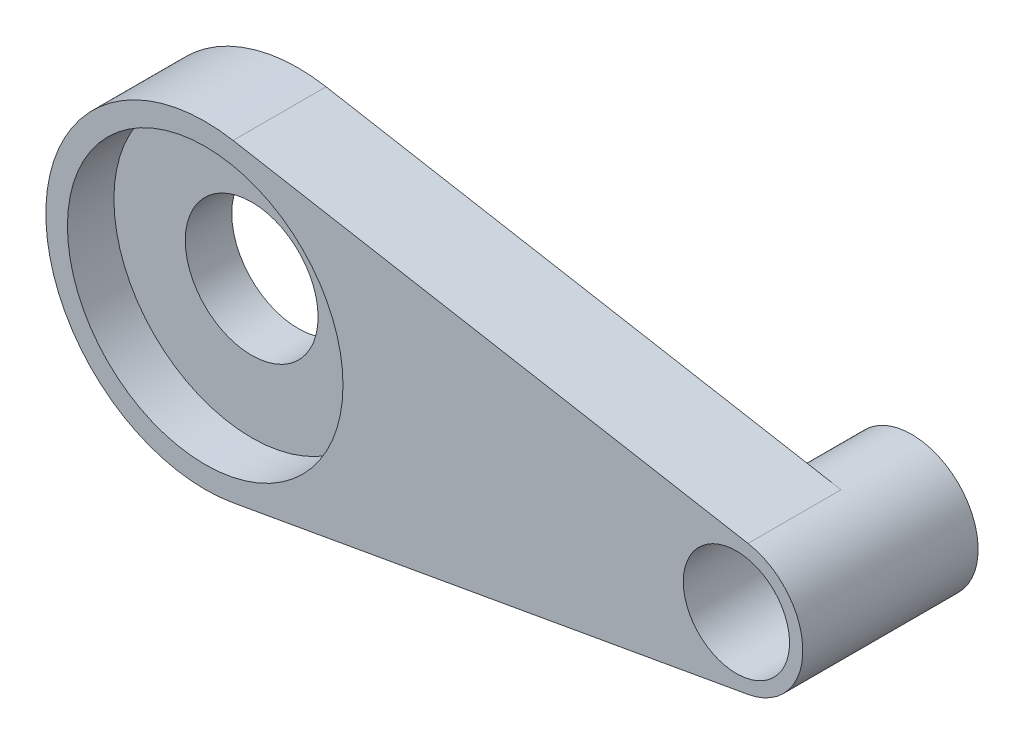
ISO-10303-21;
HEADER;
FILE_DESCRIPTION(('STEP AP214'),'2;1');
FILE_NAME('part.step','',(''),(''),'','','');
FILE_SCHEMA(('AUTOMOTIVE_DESIGN { 1 0 10303 214 1 1 1 1 }'));
ENDSEC;
DATA;
#1=APPLICATION_CONTEXT('core data for automotive mechanical design processes');
#2=APPLICATION_PROTOCOL_DEFINITION('international standard','automotive_design',2000,#1);
#3=PRODUCT_CONTEXT('',#1,'mechanical');
#4=PRODUCT('Part','Part','',(#3));
#5=PRODUCT_RELATED_PRODUCT_CATEGORY('part','',(#4));
#6=PRODUCT_DEFINITION_FORMATION('','',#4);
#7=PRODUCT_DEFINITION_CONTEXT('part definition',#1,'design');
#8=PRODUCT_DEFINITION('design','',#6,#7);
#9=PRODUCT_DEFINITION_SHAPE('','',#8);
#10=(LENGTH_UNIT() NAMED_UNIT(*) SI_UNIT(.MILLI.,.METRE.));
#11=(NAMED_UNIT(*) PLANE_ANGLE_UNIT() SI_UNIT($,.RADIAN.));
#12=(NAMED_UNIT(*) SI_UNIT($,.STERADIAN.) SOLID_ANGLE_UNIT());
#13=UNCERTAINTY_MEASURE_WITH_UNIT(LENGTH_MEASURE(1.E-05),#10,'distance_accuracy_value','');
#14=(GEOMETRIC_REPRESENTATION_CONTEXT(3) GLOBAL_UNCERTAINTY_ASSIGNED_CONTEXT((#13)) GLOBAL_UNIT_ASSIGNED_CONTEXT((#10,
#11,#12)) REPRESENTATION_CONTEXT('',''));
#15=CARTESIAN_POINT('',(0.,0.,0.));
#16=DIRECTION('',(0.,0.,1.));
#17=DIRECTION('',(1.,0.,0.));
#18=AXIS2_PLACEMENT_3D('',#15,#16,#17);
#19=CARTESIAN_POINT('',(0.,0.,7.));
#20=DIRECTION('',(0.,0.,-1.));
#21=DIRECTION('',(-1.,0.,0.));
#22=AXIS2_PLACEMENT_3D('',#19,#20,#21);
#23=CYLINDRICAL_SURFACE('',#22,12.);
#24=CARTESIAN_POINT('',(0.,0.,0.));
#25=DIRECTION('',(0.,0.,1.));
#26=DIRECTION('',(1.,0.,0.));
#27=AXIS2_PLACEMENT_3D('',#24,#25,#26);
#28=CIRCLE('',#27,12.);
#29=CARTESIAN_POINT('',(2.1,11.8148212005091,0.));
#30=VERTEX_POINT('',#29);
#31=CARTESIAN_POINT('',(2.1,-11.8148212005091,0.));
#32=VERTEX_POINT('',#31);
#33=EDGE_CURVE('E97',#30,#32,#28,.T.);
#34=ORIENTED_EDGE('',*,*,#33,.T.);
#35=DIRECTION('',(0.,0.,-1.));
#36=VECTOR('',#35,1.);
#37=CARTESIAN_POINT('',(2.1,-11.8148212005091,7.));
#38=LINE('',#37,#36);
#39=CARTESIAN_POINT('',(2.1,-11.8148212005091,7.));
#40=VERTEX_POINT('',#39);
#41=EDGE_CURVE('E56',#40,#32,#38,.T.);
#42=ORIENTED_EDGE('',*,*,#41,.F.);
#43=CARTESIAN_POINT('',(0.,0.,7.));
#44=DIRECTION('',(0.,0.,1.));
#45=DIRECTION('',(1.,0.,0.));
#46=AXIS2_PLACEMENT_3D('',#43,#44,#45);
#47=CIRCLE('',#46,12.);
#48=CARTESIAN_POINT('',(2.1,11.8148212005091,7.));
#49=VERTEX_POINT('',#48);
#50=EDGE_CURVE('E98',#49,#40,#47,.T.);
#51=ORIENTED_EDGE('',*,*,#50,.F.);
#52=DIRECTION('',(0.,0.,-1.));
#53=VECTOR('',#52,1.);
#54=CARTESIAN_POINT('',(2.1,11.8148212005091,7.));
#55=LINE('',#54,#53);
#56=EDGE_CURVE('E107',#49,#30,#55,.T.);
#57=ORIENTED_EDGE('',*,*,#56,.T.);
#58=EDGE_LOOP('',(#34,#42,#51,#57));
#59=FACE_BOUND('',#58,.T.);
#60=ADVANCED_FACE('F47',(#59),#23,.T.);
#61=CARTESIAN_POINT('',(40.875,-4.9228421668788,7.));
#62=DIRECTION('',(-0.175,0.984568433375761,0.));
#63=DIRECTION('',(-0.984568433375761,-0.175,0.));
#64=AXIS2_PLACEMENT_3D('',#61,#62,#63);
#65=PLANE('',#64);
#66=DIRECTION('',(0.984568433375761,0.175,0.));
#67=VECTOR('',#66,1.);
#68=CARTESIAN_POINT('',(40.875,-4.9228421668788,0.));
#69=LINE('',#68,#67);
#70=CARTESIAN_POINT('',(40.875,-4.9228421668788,0.));
#71=VERTEX_POINT('',#70);
#72=EDGE_CURVE('E99',#32,#71,#69,.T.);
#73=ORIENTED_EDGE('',*,*,#72,.T.);
#74=DIRECTION('',(0.,0.,-1.));
#75=VECTOR('',#74,1.);
#76=CARTESIAN_POINT('',(40.875,-4.9228421668788,7.));
#77=LINE('',#76,#75);
#78=CARTESIAN_POINT('',(40.875,-4.9228421668788,7.));
#79=VERTEX_POINT('',#78);
#80=EDGE_CURVE('E106',#79,#71,#77,.T.);
#81=ORIENTED_EDGE('',*,*,#80,.F.);
#82=DIRECTION('',(0.984568433375761,0.175,0.));
#83=VECTOR('',#82,1.);
#84=CARTESIAN_POINT('',(40.875,-4.9228421668788,7.));
#85=LINE('',#84,#83);
#86=EDGE_CURVE('E91',#40,#79,#85,.T.);
#87=ORIENTED_EDGE('',*,*,#86,.F.);
#88=ORIENTED_EDGE('',*,*,#41,.T.);
#89=EDGE_LOOP('',(#73,#81,#87,#88));
#90=FACE_BOUND('',#89,.T.);
#91=ADVANCED_FACE('F175',(#90),#65,.F.);
#92=CARTESIAN_POINT('',(40.,0.,7.));
#93=DIRECTION('',(0.,0.,-1.));
#94=DIRECTION('',(-1.,0.,0.));
#95=AXIS2_PLACEMENT_3D('',#92,#93,#94);
#96=CYLINDRICAL_SURFACE('',#95,5.);
#97=ORIENTED_EDGE('',*,*,#80,.T.);
#98=CARTESIAN_POINT('',(40.,0.,0.));
#99=DIRECTION('',(0.,0.,-1.));
#100=DIRECTION('',(-1.,0.,0.));
#101=AXIS2_PLACEMENT_3D('',#98,#99,#100);
#102=CIRCLE('',#101,5.);
#103=CARTESIAN_POINT('',(40.875,4.9228421668788,0.));
#104=VERTEX_POINT('',#103);
#105=EDGE_CURVE('E11',#71,#104,#102,.T.);
#106=ORIENTED_EDGE('',*,*,#105,.T.);
#107=DIRECTION('',(0.,0.,-1.));
#108=VECTOR('',#107,1.);
#109=CARTESIAN_POINT('',(40.875,4.92284216687881,7.));
#110=LINE('',#109,#108);
#111=CARTESIAN_POINT('',(40.875,4.92284216687881,7.));
#112=VERTEX_POINT('',#111);
#113=EDGE_CURVE('E102',#112,#104,#110,.T.);
#114=ORIENTED_EDGE('',*,*,#113,.F.);
#115=CARTESIAN_POINT('',(40.,0.,7.));
#116=DIRECTION('',(0.,0.,1.));
#117=DIRECTION('',(-1.,0.,0.));
#118=AXIS2_PLACEMENT_3D('',#115,#116,#117);
#119=CIRCLE('',#118,5.);
#120=EDGE_CURVE('E112',#79,#112,#119,.T.);
#121=ORIENTED_EDGE('',*,*,#120,.F.);
#122=EDGE_LOOP('',(#97,#106,#114,#121));
#123=FACE_BOUND('',#122,.T.);
#124=CARTESIAN_POINT('',(40.,0.,-6.20000000000006));
#125=DIRECTION('',(0.,0.,-1.));
#126=DIRECTION('',(-1.,0.,0.));
#127=AXIS2_PLACEMENT_3D('',#124,#125,#126);
#128=CIRCLE('',#127,5.);
#129=CARTESIAN_POINT('',(35.,0.,-6.20000000000006));
#130=VERTEX_POINT('',#129);
#131=EDGE_CURVE('E131',#130,#130,#128,.T.);
#132=ORIENTED_EDGE('',*,*,#131,.F.);
#133=EDGE_LOOP('',(#132));
#134=FACE_BOUND('',#133,.T.);
#135=ADVANCED_FACE('F110',(#123,#134),#96,.T.);
#136=CARTESIAN_POINT('',(2.1,11.8148212005091,7.));
#137=DIRECTION('',(-0.175,-0.984568433375761,0.));
#138=DIRECTION('',(0.984568433375761,-0.175,0.));
#139=AXIS2_PLACEMENT_3D('',#136,#137,#138);
#140=PLANE('',#139);
#141=DIRECTION('',(-0.984568433375761,0.175,0.));
#142=VECTOR('',#141,1.);
#143=CARTESIAN_POINT('',(2.1,11.8148212005091,0.));
#144=LINE('',#143,#142);
#145=EDGE_CURVE('E83',#104,#30,#144,.T.);
#146=ORIENTED_EDGE('',*,*,#145,.T.);
#147=ORIENTED_EDGE('',*,*,#56,.F.);
#148=DIRECTION('',(-0.984568433375761,0.175,0.));
#149=VECTOR('',#148,1.);
#150=CARTESIAN_POINT('',(2.1,11.8148212005091,7.));
#151=LINE('',#150,#149);
#152=EDGE_CURVE('E65',#112,#49,#151,.T.);
#153=ORIENTED_EDGE('',*,*,#152,.F.);
#154=ORIENTED_EDGE('',*,*,#113,.T.);
#155=EDGE_LOOP('',(#146,#147,#153,#154));
#156=FACE_BOUND('',#155,.T.);
#157=ADVANCED_FACE('F103',(#156),#140,.F.);
#158=CARTESIAN_POINT('',(0.,0.,7.));
#159=DIRECTION('',(0.,0.,1.));
#160=DIRECTION('',(1.,0.,0.));
#161=AXIS2_PLACEMENT_3D('',#158,#159,#160);
#162=PLANE('',#161);
#163=CARTESIAN_POINT('',(39.9999999999997,0.,7.));
#164=DIRECTION('',(0.,0.,-1.));
#165=DIRECTION('',(-1.,0.,0.));
#166=AXIS2_PLACEMENT_3D('',#163,#164,#165);
#167=CIRCLE('',#166,4.00000000000001);
#168=CARTESIAN_POINT('',(35.9999999999997,0.,7.));
#169=VERTEX_POINT('',#168);
#170=EDGE_CURVE('E143',#169,#169,#167,.T.);
#171=ORIENTED_EDGE('',*,*,#170,.T.);
#172=EDGE_LOOP('',(#171));
#173=FACE_BOUND('',#172,.T.);
#174=CARTESIAN_POINT('',(0.,0.,7.));
#175=DIRECTION('',(0.,0.,1.));
#176=DIRECTION('',(1.,0.,0.));
#177=AXIS2_PLACEMENT_3D('',#174,#175,#176);
#178=CIRCLE('',#177,10.375);
#179=CARTESIAN_POINT('',(10.375,0.,7.));
#180=VERTEX_POINT('',#179);
#181=EDGE_CURVE('E123',#180,#180,#178,.T.);
#182=ORIENTED_EDGE('',*,*,#181,.F.);
#183=EDGE_LOOP('',(#182));
#184=FACE_BOUND('',#183,.T.);
#185=ORIENTED_EDGE('',*,*,#50,.T.);
#186=ORIENTED_EDGE('',*,*,#86,.T.);
#187=ORIENTED_EDGE('',*,*,#120,.T.);
#188=ORIENTED_EDGE('',*,*,#152,.T.);
#189=EDGE_LOOP('',(#185,#186,#187,#188));
#190=FACE_BOUND('',#189,.T.);
#191=ADVANCED_FACE('F147',(#173,#184,#190),#162,.T.);
#192=CARTESIAN_POINT('',(0.,0.,0.));
#193=DIRECTION('',(0.,0.,1.));
#194=DIRECTION('',(1.,0.,0.));
#195=AXIS2_PLACEMENT_3D('',#192,#193,#194);
#196=PLANE('',#195);
#197=ORIENTED_EDGE('',*,*,#105,.F.);
#198=ORIENTED_EDGE('',*,*,#72,.F.);
#199=ORIENTED_EDGE('',*,*,#33,.F.);
#200=ORIENTED_EDGE('',*,*,#145,.F.);
#201=EDGE_LOOP('',(#197,#198,#199,#200));
#202=FACE_BOUND('',#201,.T.);
#203=CARTESIAN_POINT('',(2.35922392732846E-13,-6.20337115009306E-12,0.));
#204=DIRECTION('',(0.,0.,-1.));
#205=DIRECTION('',(-1.,0.,0.));
#206=AXIS2_PLACEMENT_3D('',#203,#204,#205);
#207=CIRCLE('',#206,5.00000000000204);
#208=CARTESIAN_POINT('',(-5.00000000000181,-6.20337115009306E-12,0.));
#209=VERTEX_POINT('',#208);
#210=EDGE_CURVE('E128',#209,#209,#207,.T.);
#211=ORIENTED_EDGE('',*,*,#210,.F.);
#212=EDGE_LOOP('',(#211));
#213=FACE_BOUND('',#212,.T.);
#214=ADVANCED_FACE('F94',(#202,#213),#196,.F.);
#215=CARTESIAN_POINT('',(0.,0.,3.5));
#216=DIRECTION('',(0.,0.,1.));
#217=DIRECTION('',(1.,0.,0.));
#218=AXIS2_PLACEMENT_3D('',#215,#216,#217);
#219=CYLINDRICAL_SURFACE('',#218,10.375);
#220=CARTESIAN_POINT('',(0.,0.,3.5));
#221=DIRECTION('',(0.,0.,1.));
#222=DIRECTION('',(1.,0.,0.));
#223=AXIS2_PLACEMENT_3D('',#220,#221,#222);
#224=CIRCLE('',#223,10.375);
#225=CARTESIAN_POINT('',(10.375,0.,3.5));
#226=VERTEX_POINT('',#225);
#227=EDGE_CURVE('E118',#226,#226,#224,.T.);
#228=ORIENTED_EDGE('',*,*,#227,.F.);
#229=EDGE_LOOP('',(#228));
#230=FACE_BOUND('',#229,.T.);
#231=ORIENTED_EDGE('',*,*,#181,.T.);
#232=EDGE_LOOP('',(#231));
#233=FACE_BOUND('',#232,.T.);
#234=ADVANCED_FACE('F193',(#230,#233),#219,.F.);
#235=CARTESIAN_POINT('',(0.,0.,3.5));
#236=DIRECTION('',(0.,0.,1.));
#237=DIRECTION('',(1.,0.,0.));
#238=AXIS2_PLACEMENT_3D('',#235,#236,#237);
#239=PLANE('',#238);
#240=CARTESIAN_POINT('',(2.35922392732846E-13,-6.20337115009306E-12,3.5));
#241=DIRECTION('',(0.,0.,1.));
#242=DIRECTION('',(1.,0.,0.));
#243=AXIS2_PLACEMENT_3D('',#240,#241,#242);
#244=CIRCLE('',#243,5.00000000000204);
#245=CARTESIAN_POINT('',(5.00000000000228,-6.20337115009306E-12,3.5));
#246=VERTEX_POINT('',#245);
#247=EDGE_CURVE('E50',#246,#246,#244,.T.);
#248=ORIENTED_EDGE('',*,*,#247,.F.);
#249=EDGE_LOOP('',(#248));
#250=FACE_BOUND('',#249,.T.);
#251=ORIENTED_EDGE('',*,*,#227,.T.);
#252=EDGE_LOOP('',(#251));
#253=FACE_BOUND('',#252,.T.);
#254=ADVANCED_FACE('F198',(#250,#253),#239,.T.);
#255=CARTESIAN_POINT('',(2.35922392732846E-13,-6.20337115009306E-12,7.));
#256=DIRECTION('',(0.,0.,-1.));
#257=DIRECTION('',(-1.,0.,0.));
#258=AXIS2_PLACEMENT_3D('',#255,#256,#257);
#259=CYLINDRICAL_SURFACE('',#258,5.00000000000204);
#260=ORIENTED_EDGE('',*,*,#247,.T.);
#261=EDGE_LOOP('',(#260));
#262=FACE_BOUND('',#261,.T.);
#263=ORIENTED_EDGE('',*,*,#210,.T.);
#264=EDGE_LOOP('',(#263));
#265=FACE_BOUND('',#264,.T.);
#266=ADVANCED_FACE('F171',(#262,#265),#259,.F.);
#267=CARTESIAN_POINT('',(35.3218817713474,-0.823231339750691,-6.20000000000006));
#268=DIRECTION('',(0.,0.,-1.));
#269=DIRECTION('',(0.173311861000146,-0.984866995505823,0.));
#270=AXIS2_PLACEMENT_3D('',#267,#268,#269);
#271=PLANE('',#270);
#272=CARTESIAN_POINT('',(39.9999999999997,0.,-6.1999999999999));
#273=DIRECTION('',(0.,0.,-1.));
#274=DIRECTION('',(-1.,0.,0.));
#275=AXIS2_PLACEMENT_3D('',#272,#273,#274);
#276=CIRCLE('',#275,2.);
#277=CARTESIAN_POINT('',(37.9999999999997,0.,-6.1999999999999));
#278=VERTEX_POINT('',#277);
#279=EDGE_CURVE('E133',#278,#278,#276,.T.);
#280=ORIENTED_EDGE('',*,*,#279,.F.);
#281=EDGE_LOOP('',(#280));
#282=FACE_BOUND('',#281,.T.);
#283=ORIENTED_EDGE('',*,*,#131,.T.);
#284=EDGE_LOOP('',(#283));
#285=FACE_BOUND('',#284,.T.);
#286=ADVANCED_FACE('F165',(#282,#285),#271,.T.);
#287=CARTESIAN_POINT('',(39.9999999999997,0.,-14.4499999999999));
#288=DIRECTION('',(0.,0.,-1.));
#289=DIRECTION('',(-1.,0.,0.));
#290=AXIS2_PLACEMENT_3D('',#287,#288,#289);
#291=CYLINDRICAL_SURFACE('',#290,2.);
#292=CARTESIAN_POINT('',(39.9999999999997,0.,-2.6999999999999));
#293=DIRECTION('',(0.,0.,-1.));
#294=DIRECTION('',(-1.,0.,0.));
#295=AXIS2_PLACEMENT_3D('',#292,#293,#294);
#296=CIRCLE('',#295,2.);
#297=CARTESIAN_POINT('',(37.9999999999997,0.,-2.6999999999999));
#298=VERTEX_POINT('',#297);
#299=EDGE_CURVE('E137',#298,#298,#296,.T.);
#300=ORIENTED_EDGE('',*,*,#299,.F.);
#301=EDGE_LOOP('',(#300));
#302=FACE_BOUND('',#301,.T.);
#303=ORIENTED_EDGE('',*,*,#279,.T.);
#304=EDGE_LOOP('',(#303));
#305=FACE_BOUND('',#304,.T.);
#306=ADVANCED_FACE('F159',(#302,#305),#291,.F.);
#307=CARTESIAN_POINT('',(37.9999999999997,0.,-2.6999999999999));
#308=DIRECTION('',(0.,0.,-1.));
#309=DIRECTION('',(-1.,0.,0.));
#310=AXIS2_PLACEMENT_3D('',#307,#308,#309);
#311=PLANE('',#310);
#312=CARTESIAN_POINT('',(39.9999999999997,0.,-2.6999999999999));
#313=DIRECTION('',(0.,0.,-1.));
#314=DIRECTION('',(-1.,0.,0.));
#315=AXIS2_PLACEMENT_3D('',#312,#313,#314);
#316=CIRCLE('',#315,4.00000000000001);
#317=CARTESIAN_POINT('',(35.9999999999997,0.,-2.6999999999999));
#318=VERTEX_POINT('',#317);
#319=EDGE_CURVE('E140',#318,#318,#316,.T.);
#320=ORIENTED_EDGE('',*,*,#319,.F.);
#321=EDGE_LOOP('',(#320));
#322=FACE_BOUND('',#321,.T.);
#323=ORIENTED_EDGE('',*,*,#299,.T.);
#324=EDGE_LOOP('',(#323));
#325=FACE_BOUND('',#324,.T.);
#326=ADVANCED_FACE('F153',(#322,#325),#311,.F.);
#327=CARTESIAN_POINT('',(39.9999999999997,0.,-14.4499999999999));
#328=DIRECTION('',(0.,0.,-1.));
#329=DIRECTION('',(-1.,0.,0.));
#330=AXIS2_PLACEMENT_3D('',#327,#328,#329);
#331=CYLINDRICAL_SURFACE('',#330,4.00000000000001);
#332=ORIENTED_EDGE('',*,*,#170,.F.);
#333=EDGE_LOOP('',(#332));
#334=FACE_BOUND('',#333,.T.);
#335=ORIENTED_EDGE('',*,*,#319,.T.);
#336=EDGE_LOOP('',(#335));
#337=FACE_BOUND('',#336,.T.);
#338=ADVANCED_FACE('F150',(#334,#337),#331,.F.);
#339=CLOSED_SHELL('',(#60,#91,#135,#157,#191,#214,#234,#254,#266,#286,#306,#326,#338));
#340=MANIFOLD_SOLID_BREP('B2',#339);
#341=ADVANCED_BREP_SHAPE_REPRESENTATION('',(#18,#340),#14);
#342=SHAPE_DEFINITION_REPRESENTATION(#9,#341);
ENDSEC;
END-ISO-10303-21;
